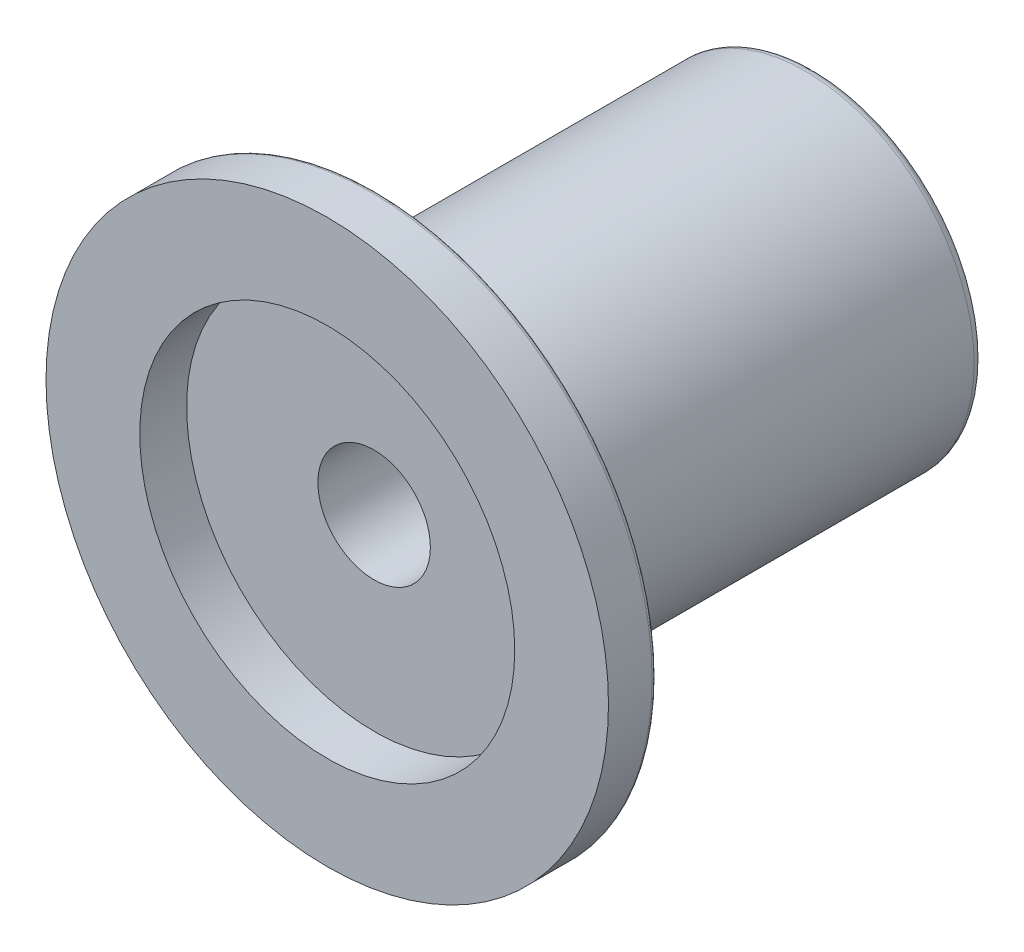
ISO-10303-21;
HEADER;
FILE_DESCRIPTION(('STEP AP214'),'2;1');
FILE_NAME('part.step','',(''),(''),'','','');
FILE_SCHEMA(('AUTOMOTIVE_DESIGN { 1 0 10303 214 1 1 1 1 }'));
ENDSEC;
DATA;
#1=APPLICATION_CONTEXT('core data for automotive mechanical design processes');
#2=APPLICATION_PROTOCOL_DEFINITION('international standard','automotive_design',2000,#1);
#3=PRODUCT_CONTEXT('',#1,'mechanical');
#4=PRODUCT('Part','Part','',(#3));
#5=PRODUCT_RELATED_PRODUCT_CATEGORY('part','',(#4));
#6=PRODUCT_DEFINITION_FORMATION('','',#4);
#7=PRODUCT_DEFINITION_CONTEXT('part definition',#1,'design');
#8=PRODUCT_DEFINITION('design','',#6,#7);
#9=PRODUCT_DEFINITION_SHAPE('','',#8);
#10=(LENGTH_UNIT() NAMED_UNIT(*) SI_UNIT(.MILLI.,.METRE.));
#11=(NAMED_UNIT(*) PLANE_ANGLE_UNIT() SI_UNIT($,.RADIAN.));
#12=(NAMED_UNIT(*) SI_UNIT($,.STERADIAN.) SOLID_ANGLE_UNIT());
#13=UNCERTAINTY_MEASURE_WITH_UNIT(LENGTH_MEASURE(1.E-05),#10,'distance_accuracy_value','');
#14=(GEOMETRIC_REPRESENTATION_CONTEXT(3) GLOBAL_UNCERTAINTY_ASSIGNED_CONTEXT((#13)) GLOBAL_UNIT_ASSIGNED_CONTEXT((#10,
#11,#12)) REPRESENTATION_CONTEXT('',''));
#15=CARTESIAN_POINT('',(0.,0.,0.));
#16=DIRECTION('',(0.,0.,1.));
#17=DIRECTION('',(1.,0.,0.));
#18=AXIS2_PLACEMENT_3D('',#15,#16,#17);
#19=CARTESIAN_POINT('',(0.,0.,-25.5));
#20=DIRECTION('',(0.,0.,1.));
#21=DIRECTION('',(1.,0.,0.));
#22=AXIS2_PLACEMENT_3D('',#19,#20,#21);
#23=TOROIDAL_SURFACE('',#22,8.5,0.5);
#24=CARTESIAN_POINT('',(0.,0.,-25.5));
#25=DIRECTION('',(0.,0.,1.));
#26=DIRECTION('',(1.,0.,0.));
#27=AXIS2_PLACEMENT_3D('',#24,#25,#26);
#28=CIRCLE('',#27,9.);
#29=CARTESIAN_POINT('',(9.,0.,-25.5));
#30=VERTEX_POINT('',#29);
#31=EDGE_CURVE('E202',#30,#30,#28,.T.);
#32=ORIENTED_EDGE('',*,*,#31,.F.);
#33=EDGE_LOOP('',(#32));
#34=FACE_BOUND('',#33,.T.);
#35=CARTESIAN_POINT('',(0.,0.,-25.75));
#36=DIRECTION('',(0.,0.,-1.));
#37=DIRECTION('',(-1.,0.,0.));
#38=AXIS2_PLACEMENT_3D('',#35,#36,#37);
#39=CIRCLE('',#38,8.93301270189222);
#40=CARTESIAN_POINT('',(-0.125,8.93213809410534,-25.75));
#41=VERTEX_POINT('',#40);
#42=CARTESIAN_POINT('',(0.125,8.93213809410534,-25.75));
#43=VERTEX_POINT('',#42);
#44=EDGE_CURVE('E11',#41,#43,#39,.T.);
#45=ORIENTED_EDGE('',*,*,#44,.F.);
#46=CARTESIAN_POINT('',(-0.125,8.199700172229,-25.900488840169));
#47=CARTESIAN_POINT('',(-0.125,8.17720379685167,-25.8836742274133));
#48=CARTESIAN_POINT('',(-0.125,8.15611089750623,-25.8649477273004));
#49=CARTESIAN_POINT('',(-0.125,8.11735123349896,-25.8242033620876));
#50=CARTESIAN_POINT('',(-0.125,8.09968862128482,-25.8021815643135));
#51=CARTESIAN_POINT('',(-0.125,8.06831900589168,-25.7554930388957));
#52=CARTESIAN_POINT('',(-0.125,8.05461013811328,-25.7308275655713));
#53=CARTESIAN_POINT('',(-0.125,8.03153237813796,-25.6795517114337));
#54=CARTESIAN_POINT('',(-0.125,8.02216240814556,-25.6529418155247));
#55=CARTESIAN_POINT('',(-0.125,8.00802255470881,-25.5985258175159));
#56=CARTESIAN_POINT('',(-0.125,8.00325278394537,-25.5707196861321));
#57=CARTESIAN_POINT('',(-0.125,7.99844938041654,-25.5147002538047));
#58=CARTESIAN_POINT('',(-0.125,7.99841593139091,-25.4864869371073));
#59=CARTESIAN_POINT('',(-0.125,8.00308632832305,-25.4304574984176));
#60=CARTESIAN_POINT('',(-0.125,8.00778978697437,-25.4026413441404));
#61=CARTESIAN_POINT('',(-0.125,8.0217997960847,-25.3481935282055));
#62=CARTESIAN_POINT('',(-0.125,8.0311063371781,-25.3215618641379));
#63=CARTESIAN_POINT('',(-0.125,8.05405838105397,-25.2702383401008));
#64=CARTESIAN_POINT('',(-0.125,8.06770396904525,-25.2455465182373));
#65=CARTESIAN_POINT('',(-0.125,8.09894649300226,-25.1988040109961));
#66=CARTESIAN_POINT('',(-0.125,8.11654342350867,-25.1767533219695));
#67=CARTESIAN_POINT('',(-0.125,8.15519076029116,-25.13591682343));
#68=CARTESIAN_POINT('',(-0.125,8.176241475969,-25.117131306733));
#69=CARTESIAN_POINT('',(-0.125,8.22119765373653,-25.0833605094723));
#70=CARTESIAN_POINT('',(-0.125,8.24510312063422,-25.0683752353091));
#71=CARTESIAN_POINT('',(-0.125,8.29509312471756,-25.0426285402645));
#72=CARTESIAN_POINT('',(-0.125,8.32117791151173,-25.0318676040245));
#73=CARTESIAN_POINT('',(-0.125,8.37478375117763,-25.0148773062953));
#74=CARTESIAN_POINT('',(-0.125,8.40230480423706,-25.0086479453985));
#75=CARTESIAN_POINT('',(-0.125,8.45800447716143,-25.0008971775093));
#76=CARTESIAN_POINT('',(-0.125,8.48618315318102,-24.9993761740581));
#77=CARTESIAN_POINT('',(-0.125,8.54239592668714,-25.0010864426365));
#78=CARTESIAN_POINT('',(-0.125,8.57043002412428,-25.0043177162895));
#79=CARTESIAN_POINT('',(-0.125,8.62555840251948,-25.0154410181546));
#80=CARTESIAN_POINT('',(-0.125,8.65265266452552,-25.0233331402961));
#81=CARTESIAN_POINT('',(-0.125,8.70513155265913,-25.0435543210579));
#82=CARTESIAN_POINT('',(-0.125,8.73051617915716,-25.0558833787168));
#83=CARTESIAN_POINT('',(-0.125,8.7788538456034,-25.0846278893286));
#84=CARTESIAN_POINT('',(-0.125,8.80180700261326,-25.1010431454263));
#85=CARTESIAN_POINT('',(-0.125,8.84463132479739,-25.1374944993719));
#86=CARTESIAN_POINT('',(-0.125,8.86450249121993,-25.1575305957533));
#87=CARTESIAN_POINT('',(-0.125,8.90059680128503,-25.2006529273513));
#88=CARTESIAN_POINT('',(-0.125,8.91682027664974,-25.2237388849092));
#89=CARTESIAN_POINT('',(-0.125,8.94516072295828,-25.2723070227923));
#90=CARTESIAN_POINT('',(-0.125,8.95727769661918,-25.297789201532));
#91=CARTESIAN_POINT('',(-0.125,8.97706000339972,-25.3504238195969));
#92=CARTESIAN_POINT('',(-0.125,8.98472575872434,-25.3775761002401));
#93=CARTESIAN_POINT('',(-0.125,8.99538967384138,-25.4327822882748));
#94=CARTESIAN_POINT('',(-0.125,8.99838783363822,-25.4608361956654));
#95=CARTESIAN_POINT('',(-0.125,8.99963135077307,-25.5170474195791));
#96=CARTESIAN_POINT('',(-0.125,8.99787699984173,-25.5452047296487));
#97=CARTESIAN_POINT('',(-0.125,8.98966595434462,-25.6008251237424));
#98=CARTESIAN_POINT('',(-0.125,8.98320926536125,-25.6282882085904));
#99=CARTESIAN_POINT('',(-0.125,8.9657769897616,-25.6817404361824));
#100=CARTESIAN_POINT('',(-0.125,8.95480143274207,-25.7077295885788));
#101=CARTESIAN_POINT('',(-0.125,8.92864309032501,-25.7574965543138));
#102=CARTESIAN_POINT('',(-0.125,8.9134602965484,-25.7812743632482));
#103=CARTESIAN_POINT('',(-0.125,8.87931774700057,-25.8259449266947));
#104=CARTESIAN_POINT('',(-0.125,8.86035780373865,-25.8468375379037));
#105=CARTESIAN_POINT('',(-0.125,8.81919969804872,-25.8851435108979));
#106=CARTESIAN_POINT('',(-0.125,8.79700152764545,-25.902556864114));
#107=CARTESIAN_POINT('',(-0.125,8.74999457502003,-25.9334119545913));
#108=CARTESIAN_POINT('',(-0.125,8.72518550783068,-25.9468532577109));
#109=CARTESIAN_POINT('',(-0.125,8.67366399091259,-25.9693798904974));
#110=CARTESIAN_POINT('',(-0.125,8.64695161489758,-25.9784653887561));
#111=CARTESIAN_POINT('',(-0.125,8.59238124372753,-25.9920235901627));
#112=CARTESIAN_POINT('',(-0.125,8.56452325944842,-25.9964963370917));
#113=CARTESIAN_POINT('',(-0.125,8.50844413527645,-26.00070239321));
#114=CARTESIAN_POINT('',(-0.125,8.48022290671534,-26.0004345224133));
#115=CARTESIAN_POINT('',(-0.125,8.42421337085282,-25.9951645246871));
#116=CARTESIAN_POINT('',(-0.125,8.39642530425455,-25.9901598546575));
#117=CARTESIAN_POINT('',(-0.125,8.34210836296188,-25.9755565164538));
#118=CARTESIAN_POINT('',(-0.125,8.31557801415072,-25.9659633802637));
#119=CARTESIAN_POINT('',(-0.125,8.27410564296965,-25.9468852706157));
#120=CARTESIAN_POINT('',(-0.125,8.25854821472358,-25.9387082473927));
#121=CARTESIAN_POINT('',(-0.125,8.22837772667702,-25.9207661907471));
#122=CARTESIAN_POINT('',(-0.125,8.21376466690796,-25.9110011572719));
#123=CARTESIAN_POINT('',(-0.125,8.199700172229,-25.900488840169));
#124=B_SPLINE_CURVE_WITH_KNOTS('',3,(#46,#47,#48,#49,#50,#51,#52,#53,#54,#55,#56,#57,#58,#59,
#60,#61,#62,#63,#64,#65,#66,#67,#68,#69,#70,#71,#72,#73,#74,#75,#76,#77,#78,#79,#80,#81,#82,#83,
#84,#85,#86,#87,#88,#89,#90,#91,#92,#93,#94,#95,#96,#97,#98,#99,#100,#101,#102,#103,#104,#105,
#106,#107,#108,#109,#110,#111,#112,#113,#114,#115,#116,#117,#118,#119,#120,#121,#122,#123),
.UNSPECIFIED.,.T.,.F.,(4,2,2,2,2,2,2,2,2,2,2,2,2,2,2,2,2,2,2,2,2,2,2,2,2,2,2,2,2,2,2,2,2,2,2,2,
2,2,4),(0.,0.0841936366220858,0.168488565013755,0.252743674379154,0.336977843275526,
0.421214075417619,0.505453575399621,0.589686188219105,0.67391862965618,0.758152725325044,
0.842386704613535,0.926628233990714,1.01086990524993,1.09512123839563,1.17937258255236,
1.26363114747529,1.34788974118157,1.43215003299667,1.51641030655295,1.60066652160282,
1.68492270252707,1.7691712180661,1.85341967786165,1.93766014525378,2.02190061256616,
2.10613590893404,2.19037110530187,2.27460574997221,2.35884056240409,2.44307955713818,
2.52731875934353,2.61156716541902,2.6958123103889,2.78005665575442,2.86432197065512,
2.94863255172847,3.03284174082806,3.08547870545102,3.13811567182505),.UNSPECIFIED.);
#125=CARTESIAN_POINT('',(-0.125,8.49908083265478,-26.));
#126=VERTEX_POINT('',#125);
#127=EDGE_CURVE('E62',#41,#126,#124,.T.);
#128=ORIENTED_EDGE('',*,*,#127,.T.);
#129=CARTESIAN_POINT('',(0.,0.,-26.));
#130=DIRECTION('',(0.,0.,1.));
#131=DIRECTION('',(1.,0.,0.));
#132=AXIS2_PLACEMENT_3D('',#129,#130,#131);
#133=CIRCLE('',#132,8.49999999999999);
#134=CARTESIAN_POINT('',(0.125,8.49908083265478,-26.));
#135=VERTEX_POINT('',#134);
#136=EDGE_CURVE('E172',#126,#135,#133,.T.);
#137=ORIENTED_EDGE('',*,*,#136,.T.);
#138=CARTESIAN_POINT('',(0.125,8.199700172229,-25.900488840169));
#139=CARTESIAN_POINT('',(0.125,8.22220145323637,-25.917304009899));
#140=CARTESIAN_POINT('',(0.125,8.24613926960724,-25.9322310975505));
#141=CARTESIAN_POINT('',(0.125,8.29620145908554,-25.957866340009));
#142=CARTESIAN_POINT('',(0.125,8.32232843367009,-25.9685693864602));
#143=CARTESIAN_POINT('',(0.125,8.37599847486985,-25.9854321389156));
#144=CARTESIAN_POINT('',(0.125,8.40354085554176,-25.9915940238846));
#145=CARTESIAN_POINT('',(0.125,8.45926162032251,-25.9992045853244));
#146=CARTESIAN_POINT('',(0.125,8.48743984458256,-26.0006544333801));
#147=CARTESIAN_POINT('',(0.125,8.54364404367157,-25.9988036003505));
#148=CARTESIAN_POINT('',(0.125,8.57166999622124,-25.9955022419436));
#149=CARTESIAN_POINT('',(0.125,8.62677091376976,-25.9842409886261));
#150=CARTESIAN_POINT('',(0.125,8.65384584132298,-25.9762809105007));
#151=CARTESIAN_POINT('',(0.125,8.70627398598635,-25.9559283105175));
#152=CARTESIAN_POINT('',(0.125,8.73162726303895,-25.9435359430723));
#153=CARTESIAN_POINT('',(0.125,8.77989319845632,-25.9146703662086));
#154=CARTESIAN_POINT('',(0.125,8.80280586255417,-25.8981971663764));
#155=CARTESIAN_POINT('',(0.125,8.84553839403555,-25.8616387718694));
#156=CARTESIAN_POINT('',(0.125,8.86535848536076,-25.841553838957));
#157=CARTESIAN_POINT('',(0.125,8.90134493958417,-25.7983412902383));
#158=CARTESIAN_POINT('',(0.125,8.91751131096582,-25.7752136814968));
#159=CARTESIAN_POINT('',(0.125,8.94572978883415,-25.7265746991836));
#160=CARTESIAN_POINT('',(0.125,8.95778229676249,-25.7010635585129));
#161=CARTESIAN_POINT('',(0.125,8.97743290103002,-25.6483797871788));
#162=CARTESIAN_POINT('',(0.125,8.98503099484802,-25.6212071555751));
#163=CARTESIAN_POINT('',(0.125,8.99555648172927,-25.5659741778991));
#164=CARTESIAN_POINT('',(0.125,8.99848425870687,-25.5379139049871));
#165=CARTESIAN_POINT('',(0.125,8.99958715422753,-25.4817001287987));
#166=CARTESIAN_POINT('',(0.125,8.99776227602579,-25.4535466255862));
#167=CARTESIAN_POINT('',(0.125,8.98941184979909,-25.3979466042679));
#168=CARTESIAN_POINT('',(0.125,8.98288646633201,-25.3705000614473));
#169=CARTESIAN_POINT('',(0.125,8.96532054270046,-25.3170920150047));
#170=CARTESIAN_POINT('',(0.125,8.95428000179754,-25.2911305116256));
#171=CARTESIAN_POINT('',(0.125,8.92799697713144,-25.241428796599));
#172=CARTESIAN_POINT('',(0.125,8.91275439185356,-25.2176886386343));
#173=CARTESIAN_POINT('',(0.125,8.87850021457871,-25.1731040462629));
#174=CARTESIAN_POINT('',(0.125,8.8594886214794,-25.1522596127033));
#175=CARTESIAN_POINT('',(0.125,8.81823462556436,-25.1140564708128));
#176=CARTESIAN_POINT('',(0.125,8.79599198086628,-25.0966980236812));
#177=CARTESIAN_POINT('',(0.125,8.7489083942851,-25.065961295898));
#178=CARTESIAN_POINT('',(0.125,8.72406745092221,-25.0525830175132));
#179=CARTESIAN_POINT('',(0.125,8.67248982314124,-25.0301850172335));
#180=CARTESIAN_POINT('',(0.125,8.64575295331565,-25.0211657222907));
#181=CARTESIAN_POINT('',(0.125,8.59114456176697,-25.0077434739123));
#182=CARTESIAN_POINT('',(0.125,8.56327303961345,-25.0033405222281));
#183=CARTESIAN_POINT('',(0.125,8.50718409190774,-24.999275654406));
#184=CARTESIAN_POINT('',(0.125,8.47896663825487,-24.9996141260074));
#185=CARTESIAN_POINT('',(0.125,8.42298901587974,-25.0050234191815));
#186=CARTESIAN_POINT('',(0.125,8.39522884746722,-25.0100942439596));
#187=CARTESIAN_POINT('',(0.125,8.34095300541873,-25.024824592074));
#188=CARTESIAN_POINT('',(0.125,8.31443736845368,-25.0344842505302));
#189=CARTESIAN_POINT('',(0.125,8.26340428474078,-25.0581182275118));
#190=CARTESIAN_POINT('',(0.125,8.23888683565007,-25.0720925409783));
#191=CARTESIAN_POINT('',(0.125,8.19254725218564,-25.1039586090007));
#192=CARTESIAN_POINT('',(0.125,8.17072500398284,-25.1218501980258));
#193=CARTESIAN_POINT('',(0.125,8.1303943160026,-25.1610434387843));
#194=CARTESIAN_POINT('',(0.125,8.11188588056796,-25.1823450949866));
#195=CARTESIAN_POINT('',(0.125,8.07871030435073,-25.2277514666601));
#196=CARTESIAN_POINT('',(0.125,8.06404277367507,-25.2518558972606));
#197=CARTESIAN_POINT('',(0.125,8.03896319156648,-25.3021853648014));
#198=CARTESIAN_POINT('',(0.125,8.0285511459191,-25.3284104046246));
#199=CARTESIAN_POINT('',(0.125,8.01227917319714,-25.3822338954176));
#200=CARTESIAN_POINT('',(0.125,8.00641881538534,-25.4098322161676));
#201=CARTESIAN_POINT('',(0.125,7.99941528411776,-25.4656199651686));
#202=CARTESIAN_POINT('',(0.125,7.99827192309759,-25.4938093698713));
#203=CARTESIAN_POINT('',(0.125,8.00073394035745,-25.5499748915294));
#204=CARTESIAN_POINT('',(0.125,8.00433848403553,-25.5779510451014));
#205=CARTESIAN_POINT('',(0.125,8.01619467577962,-25.6329086487571));
#206=CARTESIAN_POINT('',(0.125,8.02444747845161,-25.6598898499244));
#207=CARTESIAN_POINT('',(0.125,8.04536895590955,-25.7120943945644));
#208=CARTESIAN_POINT('',(0.125,8.05803977238668,-25.7373168783466));
#209=CARTESIAN_POINT('',(0.125,8.08742856236716,-25.7852533384666));
#210=CARTESIAN_POINT('',(0.125,8.10414165037331,-25.8079702950942));
#211=CARTESIAN_POINT('',(0.125,8.13417546612596,-25.8423196706877));
#212=CARTESIAN_POINT('',(0.125,8.14641617488073,-25.8549129971238));
#213=CARTESIAN_POINT('',(0.125,8.1721511586333,-25.8787460405395));
#214=CARTESIAN_POINT('',(0.125,8.18564543365263,-25.8899857574958));
#215=CARTESIAN_POINT('',(0.125,8.199700172229,-25.900488840169));
#216=B_SPLINE_CURVE_WITH_KNOTS('',3,(#138,#139,#140,#141,#142,#143,#144,#145,#146,#147,#148,
#149,#150,#151,#152,#153,#154,#155,#156,#157,#158,#159,#160,#161,#162,#163,#164,#165,#166,#167,
#168,#169,#170,#171,#172,#173,#174,#175,#176,#177,#178,#179,#180,#181,#182,#183,#184,#185,#186,
#187,#188,#189,#190,#191,#192,#193,#194,#195,#196,#197,#198,#199,#200,#201,#202,#203,#204,#205,
#206,#207,#208,#209,#210,#211,#212,#213,#214,#215),.UNSPECIFIED.,.T.,.F.,(4,2,2,2,2,2,2,2,2,2,2,
2,2,2,2,2,2,2,2,2,2,2,2,2,2,2,2,2,2,2,2,2,2,2,2,2,2,2,4),(0.,0.0842064581781906,
0.168514441882478,0.252781946086247,0.337028496700853,0.421287058509894,0.505548934200556,
0.589807874652151,0.674066617172738,0.758319255452026,0.842571698105777,0.926815916831314,
1.01106018323886,1.09529752415273,1.17953480737055,1.26376914170642,1.34800348981908,
1.43223987307793,1.51647628097401,1.60071899821254,1.68496176342939,1.76921277835437,
1.85346382524143,1.93772176196301,2.02197975575319,2.10624023070289,2.19050060685688,
2.27475742314155,2.35901434984531,2.44326272024813,2.52751120519091,2.61175171652446,
2.69598887812645,2.78021123422536,2.86445451999921,2.94873870073808,3.03292152005959,
3.08551851377806,3.13811550840021),.UNSPECIFIED.);
#217=EDGE_CURVE('E54',#135,#43,#216,.T.);
#218=ORIENTED_EDGE('',*,*,#217,.T.);
#219=EDGE_LOOP('',(#45,#128,#137,#218));
#220=FACE_BOUND('',#219,.T.);
#221=ADVANCED_FACE('F39',(#34,#220),#23,.T.);
#222=CARTESIAN_POINT('',(0.,0.,-26.));
#223=DIRECTION('',(0.,0.,1.));
#224=DIRECTION('',(1.,0.,0.));
#225=AXIS2_PLACEMENT_3D('',#222,#223,#224);
#226=PLANE('',#225);
#227=ORIENTED_EDGE('',*,*,#136,.F.);
#228=DIRECTION('',(0.,1.,0.));
#229=VECTOR('',#228,1.);
#230=CARTESIAN_POINT('',(-0.125,9.5,-26.));
#231=LINE('',#230,#229);
#232=CARTESIAN_POINT('',(-0.125,6.5,-26.));
#233=VERTEX_POINT('',#232);
#234=EDGE_CURVE('E100',#233,#126,#231,.T.);
#235=ORIENTED_EDGE('',*,*,#234,.F.);
#236=DIRECTION('',(-1.,0.,0.));
#237=VECTOR('',#236,1.);
#238=CARTESIAN_POINT('',(0.125,6.5,-26.));
#239=LINE('',#238,#237);
#240=CARTESIAN_POINT('',(0.125,6.5,-26.));
#241=VERTEX_POINT('',#240);
#242=EDGE_CURVE('E102',#241,#233,#239,.T.);
#243=ORIENTED_EDGE('',*,*,#242,.F.);
#244=DIRECTION('',(0.,1.,0.));
#245=VECTOR('',#244,1.);
#246=CARTESIAN_POINT('',(0.124999999999999,0.,-26.));
#247=LINE('',#246,#245);
#248=EDGE_CURVE('E47',#241,#135,#247,.T.);
#249=ORIENTED_EDGE('',*,*,#248,.T.);
#250=EDGE_LOOP('',(#227,#235,#243,#249));
#251=FACE_BOUND('',#250,.T.);
#252=ADVANCED_FACE('F161',(#251),#226,.F.);
#253=CARTESIAN_POINT('',(0.,3.,-23.5));
#254=DIRECTION('',(0.,0.,-1.));
#255=DIRECTION('',(-1.,0.,0.));
#256=AXIS2_PLACEMENT_3D('',#253,#254,#255);
#257=PLANE('',#256);
#258=CARTESIAN_POINT('',(0.,0.,-23.5));
#259=DIRECTION('',(0.,0.,1.));
#260=DIRECTION('',(1.,0.,0.));
#261=AXIS2_PLACEMENT_3D('',#258,#259,#260);
#262=CIRCLE('',#261,3.);
#263=CARTESIAN_POINT('',(3.,0.,-23.5));
#264=VERTEX_POINT('',#263);
#265=EDGE_CURVE('E174',#264,#264,#262,.T.);
#266=ORIENTED_EDGE('',*,*,#265,.T.);
#267=EDGE_LOOP('',(#266));
#268=FACE_BOUND('',#267,.T.);
#269=ADVANCED_FACE('F158',(#268),#257,.F.);
#270=CARTESIAN_POINT('',(0.,0.,0.));
#271=DIRECTION('',(0.,0.,1.));
#272=DIRECTION('',(1.,0.,0.));
#273=AXIS2_PLACEMENT_3D('',#270,#271,#272);
#274=CYLINDRICAL_SURFACE('',#273,3.);
#275=ORIENTED_EDGE('',*,*,#265,.F.);
#276=EDGE_LOOP('',(#275));
#277=FACE_BOUND('',#276,.T.);
#278=CARTESIAN_POINT('',(0.,0.,-2.5));
#279=DIRECTION('',(0.,0.,1.));
#280=DIRECTION('',(1.,0.,0.));
#281=AXIS2_PLACEMENT_3D('',#278,#279,#280);
#282=CIRCLE('',#281,3.);
#283=CARTESIAN_POINT('',(3.,0.,-2.5));
#284=VERTEX_POINT('',#283);
#285=EDGE_CURVE('E177',#284,#284,#282,.T.);
#286=ORIENTED_EDGE('',*,*,#285,.T.);
#287=EDGE_LOOP('',(#286));
#288=FACE_BOUND('',#287,.T.);
#289=ADVANCED_FACE('F154',(#277,#288),#274,.F.);
#290=CARTESIAN_POINT('',(0.,10.,-2.5));
#291=DIRECTION('',(0.,0.,-1.));
#292=DIRECTION('',(-1.,0.,0.));
#293=AXIS2_PLACEMENT_3D('',#290,#291,#292);
#294=PLANE('',#293);
#295=ORIENTED_EDGE('',*,*,#285,.F.);
#296=EDGE_LOOP('',(#295));
#297=FACE_BOUND('',#296,.T.);
#298=CARTESIAN_POINT('',(0.,0.,-2.5));
#299=DIRECTION('',(0.,0.,1.));
#300=DIRECTION('',(1.,0.,0.));
#301=AXIS2_PLACEMENT_3D('',#298,#299,#300);
#302=CIRCLE('',#301,10.);
#303=CARTESIAN_POINT('',(10.,0.,-2.5));
#304=VERTEX_POINT('',#303);
#305=EDGE_CURVE('E182',#304,#304,#302,.T.);
#306=ORIENTED_EDGE('',*,*,#305,.T.);
#307=EDGE_LOOP('',(#306));
#308=FACE_BOUND('',#307,.T.);
#309=ADVANCED_FACE('F150',(#297,#308),#294,.F.);
#310=CARTESIAN_POINT('',(0.,0.,0.));
#311=DIRECTION('',(0.,0.,1.));
#312=DIRECTION('',(1.,0.,0.));
#313=AXIS2_PLACEMENT_3D('',#310,#311,#312);
#314=CYLINDRICAL_SURFACE('',#313,10.);
#315=ORIENTED_EDGE('',*,*,#305,.F.);
#316=EDGE_LOOP('',(#315));
#317=FACE_BOUND('',#316,.T.);
#318=CARTESIAN_POINT('',(0.,0.,0.));
#319=DIRECTION('',(0.,0.,1.));
#320=DIRECTION('',(1.,0.,0.));
#321=AXIS2_PLACEMENT_3D('',#318,#319,#320);
#322=CIRCLE('',#321,10.);
#323=CARTESIAN_POINT('',(10.,0.,0.));
#324=VERTEX_POINT('',#323);
#325=EDGE_CURVE('E185',#324,#324,#322,.T.);
#326=ORIENTED_EDGE('',*,*,#325,.T.);
#327=EDGE_LOOP('',(#326));
#328=FACE_BOUND('',#327,.T.);
#329=ADVANCED_FACE('F146',(#317,#328),#314,.F.);
#330=CARTESIAN_POINT('',(0.,10.,0.));
#331=DIRECTION('',(0.,0.,-1.));
#332=DIRECTION('',(-1.,0.,0.));
#333=AXIS2_PLACEMENT_3D('',#330,#331,#332);
#334=PLANE('',#333);
#335=ORIENTED_EDGE('',*,*,#325,.F.);
#336=EDGE_LOOP('',(#335));
#337=FACE_BOUND('',#336,.T.);
#338=CARTESIAN_POINT('',(0.,0.,0.));
#339=DIRECTION('',(0.,0.,1.));
#340=DIRECTION('',(1.,0.,0.));
#341=AXIS2_PLACEMENT_3D('',#338,#339,#340);
#342=CIRCLE('',#341,15.);
#343=CARTESIAN_POINT('',(15.,0.,0.));
#344=VERTEX_POINT('',#343);
#345=EDGE_CURVE('E188',#344,#344,#342,.T.);
#346=ORIENTED_EDGE('',*,*,#345,.T.);
#347=EDGE_LOOP('',(#346));
#348=FACE_BOUND('',#347,.T.);
#349=ADVANCED_FACE('F142',(#337,#348),#334,.F.);
#350=CARTESIAN_POINT('',(0.,0.,0.));
#351=DIRECTION('',(0.,0.,1.));
#352=DIRECTION('',(1.,0.,0.));
#353=AXIS2_PLACEMENT_3D('',#350,#351,#352);
#354=CYLINDRICAL_SURFACE('',#353,15.);
#355=ORIENTED_EDGE('',*,*,#345,.F.);
#356=EDGE_LOOP('',(#355));
#357=FACE_BOUND('',#356,.T.);
#358=CARTESIAN_POINT('',(0.,0.,-2.32494811544757));
#359=DIRECTION('',(0.,0.,1.));
#360=DIRECTION('',(1.,0.,0.));
#361=AXIS2_PLACEMENT_3D('',#358,#359,#360);
#362=CIRCLE('',#361,15.);
#363=CARTESIAN_POINT('',(15.,0.,-2.32494811544757));
#364=VERTEX_POINT('',#363);
#365=EDGE_CURVE('E191',#364,#364,#362,.T.);
#366=ORIENTED_EDGE('',*,*,#365,.T.);
#367=EDGE_LOOP('',(#366));
#368=FACE_BOUND('',#367,.T.);
#369=ADVANCED_FACE('F138',(#357,#368),#354,.T.);
#370=CARTESIAN_POINT('',(0.,0.,-2.32494811544757));
#371=DIRECTION('',(0.,0.,1.));
#372=DIRECTION('',(1.,0.,0.));
#373=AXIS2_PLACEMENT_3D('',#370,#371,#372);
#374=TOROIDAL_SURFACE('',#373,14.75,0.25);
#375=ORIENTED_EDGE('',*,*,#365,.F.);
#376=EDGE_LOOP('',(#375));
#377=FACE_BOUND('',#376,.T.);
#378=CARTESIAN_POINT('',(0.,0.,-2.55987127064405));
#379=DIRECTION('',(0.,0.,1.));
#380=DIRECTION('',(1.,0.,0.));
#381=AXIS2_PLACEMENT_3D('',#378,#379,#380);
#382=CIRCLE('',#381,14.8355050358314);
#383=CARTESIAN_POINT('',(14.8355050358314,0.,-2.55987127064405));
#384=VERTEX_POINT('',#383);
#385=EDGE_CURVE('E194',#384,#384,#382,.T.);
#386=ORIENTED_EDGE('',*,*,#385,.T.);
#387=EDGE_LOOP('',(#386));
#388=FACE_BOUND('',#387,.T.);
#389=ADVANCED_FACE('F134',(#377,#388),#374,.T.);
#390=CARTESIAN_POINT('',(0.,0.,-4.62395013495317));
#391=DIRECTION('',(0.,0.,1.));
#392=DIRECTION('',(1.,0.,0.));
#393=AXIS2_PLACEMENT_3D('',#390,#391,#392);
#394=CONICAL_SURFACE('',#393,9.16449496416858,1.22173047639603);
#395=ORIENTED_EDGE('',*,*,#385,.F.);
#396=EDGE_LOOP('',(#395));
#397=FACE_BOUND('',#396,.T.);
#398=CARTESIAN_POINT('',(0.,0.,-4.62395013495317));
#399=DIRECTION('',(0.,0.,1.));
#400=DIRECTION('',(1.,0.,0.));
#401=AXIS2_PLACEMENT_3D('',#398,#399,#400);
#402=CIRCLE('',#401,9.16449496416858);
#403=CARTESIAN_POINT('',(9.16449496416858,0.,-4.62395013495317));
#404=VERTEX_POINT('',#403);
#405=EDGE_CURVE('E197',#404,#404,#402,.T.);
#406=ORIENTED_EDGE('',*,*,#405,.T.);
#407=EDGE_LOOP('',(#406));
#408=FACE_BOUND('',#407,.T.);
#409=ADVANCED_FACE('F130',(#397,#408),#394,.T.);
#410=CARTESIAN_POINT('',(0.,0.,-4.85887329014965));
#411=DIRECTION('',(0.,0.,1.));
#412=DIRECTION('',(1.,0.,0.));
#413=AXIS2_PLACEMENT_3D('',#410,#411,#412);
#414=TOROIDAL_SURFACE('',#413,9.25,0.25);
#415=ORIENTED_EDGE('',*,*,#405,.F.);
#416=EDGE_LOOP('',(#415));
#417=FACE_BOUND('',#416,.T.);
#418=CARTESIAN_POINT('',(0.,0.,-4.85887329014965));
#419=DIRECTION('',(0.,0.,1.));
#420=DIRECTION('',(1.,0.,0.));
#421=AXIS2_PLACEMENT_3D('',#418,#419,#420);
#422=CIRCLE('',#421,9.);
#423=CARTESIAN_POINT('',(9.,0.,-4.85887329014965));
#424=VERTEX_POINT('',#423);
#425=EDGE_CURVE('E200',#424,#424,#422,.T.);
#426=ORIENTED_EDGE('',*,*,#425,.T.);
#427=EDGE_LOOP('',(#426));
#428=FACE_BOUND('',#427,.T.);
#429=ADVANCED_FACE('F126',(#417,#428),#414,.F.);
#430=CARTESIAN_POINT('',(0.,0.,0.));
#431=DIRECTION('',(0.,0.,1.));
#432=DIRECTION('',(1.,0.,0.));
#433=AXIS2_PLACEMENT_3D('',#430,#431,#432);
#434=CYLINDRICAL_SURFACE('',#433,9.);
#435=ORIENTED_EDGE('',*,*,#425,.F.);
#436=EDGE_LOOP('',(#435));
#437=FACE_BOUND('',#436,.T.);
#438=ORIENTED_EDGE('',*,*,#31,.T.);
#439=EDGE_LOOP('',(#438));
#440=FACE_BOUND('',#439,.T.);
#441=ADVANCED_FACE('F123',(#437,#440),#434,.T.);
#442=CARTESIAN_POINT('',(0.,0.,-25.75));
#443=DIRECTION('',(0.,0.,-1.));
#444=DIRECTION('',(-1.,0.,0.));
#445=AXIS2_PLACEMENT_3D('',#442,#443,#444);
#446=PLANE('',#445);
#447=ORIENTED_EDGE('',*,*,#44,.T.);
#448=DIRECTION('',(0.,-1.,0.));
#449=VECTOR('',#448,1.);
#450=CARTESIAN_POINT('',(0.125,9.5,-25.75));
#451=LINE('',#450,#449);
#452=CARTESIAN_POINT('',(0.125,6.5,-25.75));
#453=VERTEX_POINT('',#452);
#454=EDGE_CURVE('E80',#43,#453,#451,.T.);
#455=ORIENTED_EDGE('',*,*,#454,.T.);
#456=DIRECTION('',(-1.,0.,0.));
#457=VECTOR('',#456,1.);
#458=CARTESIAN_POINT('',(0.125,6.5,-25.75));
#459=LINE('',#458,#457);
#460=CARTESIAN_POINT('',(-0.125,6.5,-25.75));
#461=VERTEX_POINT('',#460);
#462=EDGE_CURVE('E84',#453,#461,#459,.T.);
#463=ORIENTED_EDGE('',*,*,#462,.T.);
#464=DIRECTION('',(0.,1.,0.));
#465=VECTOR('',#464,1.);
#466=CARTESIAN_POINT('',(-0.125,9.5,-25.75));
#467=LINE('',#466,#465);
#468=EDGE_CURVE('E86',#461,#41,#467,.T.);
#469=ORIENTED_EDGE('',*,*,#468,.T.);
#470=EDGE_LOOP('',(#447,#455,#463,#469));
#471=FACE_BOUND('',#470,.T.);
#472=ADVANCED_FACE('F82',(#471),#446,.T.);
#473=CARTESIAN_POINT('',(-0.125,9.5,-25.75));
#474=DIRECTION('',(-1.,0.,0.));
#475=DIRECTION('',(0.,-1.,0.));
#476=AXIS2_PLACEMENT_3D('',#473,#474,#475);
#477=PLANE('',#476);
#478=ORIENTED_EDGE('',*,*,#468,.F.);
#479=DIRECTION('',(0.,0.,-1.));
#480=VECTOR('',#479,1.);
#481=CARTESIAN_POINT('',(-0.125,6.5,-25.75));
#482=LINE('',#481,#480);
#483=EDGE_CURVE('E94',#461,#233,#482,.T.);
#484=ORIENTED_EDGE('',*,*,#483,.T.);
#485=ORIENTED_EDGE('',*,*,#234,.T.);
#486=ORIENTED_EDGE('',*,*,#127,.F.);
#487=EDGE_LOOP('',(#478,#484,#485,#486));
#488=FACE_BOUND('',#487,.T.);
#489=ADVANCED_FACE('F118',(#488),#477,.F.);
#490=CARTESIAN_POINT('',(0.125,9.5,-25.75));
#491=DIRECTION('',(1.,0.,0.));
#492=DIRECTION('',(0.,1.,0.));
#493=AXIS2_PLACEMENT_3D('',#490,#491,#492);
#494=PLANE('',#493);
#495=ORIENTED_EDGE('',*,*,#248,.F.);
#496=DIRECTION('',(0.,0.,-1.));
#497=VECTOR('',#496,1.);
#498=CARTESIAN_POINT('',(0.125,6.5,-25.75));
#499=LINE('',#498,#497);
#500=EDGE_CURVE('E89',#453,#241,#499,.T.);
#501=ORIENTED_EDGE('',*,*,#500,.F.);
#502=ORIENTED_EDGE('',*,*,#454,.F.);
#503=ORIENTED_EDGE('',*,*,#217,.F.);
#504=EDGE_LOOP('',(#495,#501,#502,#503));
#505=FACE_BOUND('',#504,.T.);
#506=ADVANCED_FACE('F90',(#505),#494,.F.);
#507=CARTESIAN_POINT('',(0.125,6.5,-25.75));
#508=DIRECTION('',(0.,-1.,0.));
#509=DIRECTION('',(0.,0.,-1.));
#510=AXIS2_PLACEMENT_3D('',#507,#508,#509);
#511=PLANE('',#510);
#512=ORIENTED_EDGE('',*,*,#242,.T.);
#513=ORIENTED_EDGE('',*,*,#483,.F.);
#514=ORIENTED_EDGE('',*,*,#462,.F.);
#515=ORIENTED_EDGE('',*,*,#500,.T.);
#516=EDGE_LOOP('',(#512,#513,#514,#515));
#517=FACE_BOUND('',#516,.T.);
#518=ADVANCED_FACE('F96',(#517),#511,.F.);
#519=CLOSED_SHELL('',(#221,#252,#269,#289,#309,#329,#349,#369,#389,#409,#429,#441,#472,#489,
#506,#518));
#520=MANIFOLD_SOLID_BREP('B2',#519);
#521=ADVANCED_BREP_SHAPE_REPRESENTATION('',(#18,#520),#14);
#522=SHAPE_DEFINITION_REPRESENTATION(#9,#521);
ENDSEC;
END-ISO-10303-21;
